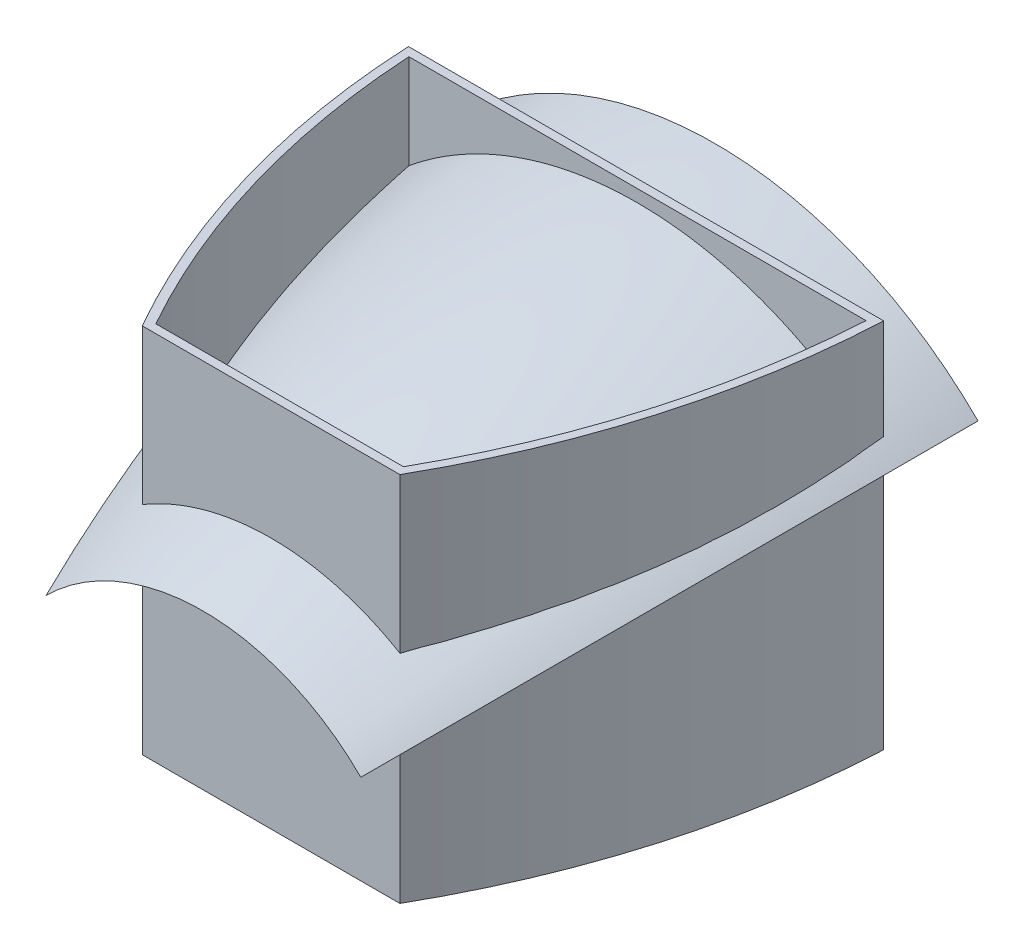
ISO-10303-21;
HEADER;
FILE_DESCRIPTION(('STEP AP214'),'2;1');
FILE_NAME('part.step','',(''),(''),'','','');
FILE_SCHEMA(('AUTOMOTIVE_DESIGN { 1 0 10303 214 1 1 1 1 }'));
ENDSEC;
DATA;
#1=APPLICATION_CONTEXT('core data for automotive mechanical design processes');
#2=APPLICATION_PROTOCOL_DEFINITION('international standard','automotive_design',2000,#1);
#3=PRODUCT_CONTEXT('',#1,'mechanical');
#4=PRODUCT('Part','Part','',(#3));
#5=PRODUCT_RELATED_PRODUCT_CATEGORY('part','',(#4));
#6=PRODUCT_DEFINITION_FORMATION('','',#4);
#7=PRODUCT_DEFINITION_CONTEXT('part definition',#1,'design');
#8=PRODUCT_DEFINITION('design','',#6,#7);
#9=PRODUCT_DEFINITION_SHAPE('','',#8);
#10=(LENGTH_UNIT() NAMED_UNIT(*) SI_UNIT(.MILLI.,.METRE.));
#11=(NAMED_UNIT(*) PLANE_ANGLE_UNIT() SI_UNIT($,.RADIAN.));
#12=(NAMED_UNIT(*) SI_UNIT($,.STERADIAN.) SOLID_ANGLE_UNIT());
#13=UNCERTAINTY_MEASURE_WITH_UNIT(LENGTH_MEASURE(1.E-05),#10,'distance_accuracy_value','');
#14=(GEOMETRIC_REPRESENTATION_CONTEXT(3) GLOBAL_UNCERTAINTY_ASSIGNED_CONTEXT((#13)) GLOBAL_UNIT_ASSIGNED_CONTEXT((#10,
#11,#12)) REPRESENTATION_CONTEXT('',''));
#15=CARTESIAN_POINT('',(0.,0.,0.));
#16=DIRECTION('',(0.,0.,1.));
#17=DIRECTION('',(1.,0.,0.));
#18=AXIS2_PLACEMENT_3D('',#15,#16,#17);
#19=CARTESIAN_POINT('',(-208.683165451727,129.750796681597,-13.5989334898139));
#20=DIRECTION('',(0.,1.,0.));
#21=DIRECTION('',(0.,0.,1.));
#22=AXIS2_PLACEMENT_3D('',#19,#20,#21);
#23=PLANE('',#22);
#24=DIRECTION('',(1.,0.,0.));
#25=VECTOR('',#24,1.);
#26=CARTESIAN_POINT('',(-45.,129.750796681597,131.));
#27=LINE('',#26,#25);
#28=CARTESIAN_POINT('',(-44.9999999999999,129.750796681597,131.));
#29=VERTEX_POINT('',#28);
#30=CARTESIAN_POINT('',(45.,129.750796681597,131.));
#31=VERTEX_POINT('',#30);
#32=EDGE_CURVE('E152',#29,#31,#27,.T.);
#33=ORIENTED_EDGE('',*,*,#32,.T.);
#34=CARTESIAN_POINT('',(-208.683165451727,129.750796681597,-13.5989334898139));
#35=DIRECTION('',(0.,1.,0.));
#36=DIRECTION('',(0.,0.,1.));
#37=AXIS2_PLACEMENT_3D('',#34,#35,#36);
#38=CIRCLE('',#37,292.);
#39=CARTESIAN_POINT('',(83.,129.750796681597,0.));
#40=VERTEX_POINT('',#39);
#41=EDGE_CURVE('E93',#31,#40,#38,.T.);
#42=ORIENTED_EDGE('',*,*,#41,.T.);
#43=DIRECTION('',(1.,0.,0.));
#44=VECTOR('',#43,1.);
#45=CARTESIAN_POINT('',(-83.,129.750796681597,0.));
#46=LINE('',#45,#44);
#47=CARTESIAN_POINT('',(-83.,129.750796681597,0.));
#48=VERTEX_POINT('',#47);
#49=EDGE_CURVE('E156',#48,#40,#46,.T.);
#50=ORIENTED_EDGE('',*,*,#49,.F.);
#51=CARTESIAN_POINT('',(208.683165451727,129.750796681597,-13.598933489814));
#52=DIRECTION('',(0.,-1.,0.));
#53=DIRECTION('',(0.,0.,-1.));
#54=AXIS2_PLACEMENT_3D('',#51,#52,#53);
#55=CIRCLE('',#54,292.);
#56=EDGE_CURVE('E159',#29,#48,#55,.T.);
#57=ORIENTED_EDGE('',*,*,#56,.F.);
#58=EDGE_LOOP('',(#33,#42,#50,#57));
#59=FACE_BOUND('',#58,.T.);
#60=DIRECTION('',(1.,0.,0.));
#61=VECTOR('',#60,1.);
#62=CARTESIAN_POINT('',(-45.,129.750796681597,128.));
#63=LINE('',#62,#61);
#64=CARTESIAN_POINT('',(-43.2508378795962,129.750796681597,128.));
#65=VERTEX_POINT('',#64);
#66=CARTESIAN_POINT('',(43.2508378795962,129.750796681597,128.));
#67=VERTEX_POINT('',#66);
#68=EDGE_CURVE('E142',#65,#67,#63,.T.);
#69=ORIENTED_EDGE('',*,*,#68,.F.);
#70=CARTESIAN_POINT('',(208.683165451727,129.750796681597,-13.598933489814));
#71=DIRECTION('',(0.,1.,0.));
#72=DIRECTION('',(0.,0.,1.));
#73=AXIS2_PLACEMENT_3D('',#70,#71,#72);
#74=CIRCLE('',#73,289.);
#75=CARTESIAN_POINT('',(-79.839754620493,129.750796681597,3.));
#76=VERTEX_POINT('',#75);
#77=EDGE_CURVE('E123',#65,#76,#74,.F.);
#78=ORIENTED_EDGE('',*,*,#77,.T.);
#79=DIRECTION('',(1.,0.,0.));
#80=VECTOR('',#79,1.);
#81=CARTESIAN_POINT('',(-83.,129.750796681597,3.));
#82=LINE('',#81,#80);
#83=CARTESIAN_POINT('',(79.839754620493,129.750796681597,3.));
#84=VERTEX_POINT('',#83);
#85=EDGE_CURVE('E58',#76,#84,#82,.T.);
#86=ORIENTED_EDGE('',*,*,#85,.T.);
#87=CARTESIAN_POINT('',(-208.683165451727,129.750796681597,-13.5989334898139));
#88=DIRECTION('',(0.,1.,0.));
#89=DIRECTION('',(0.,0.,1.));
#90=AXIS2_PLACEMENT_3D('',#87,#88,#89);
#91=CIRCLE('',#90,289.);
#92=EDGE_CURVE('E144',#67,#84,#91,.T.);
#93=ORIENTED_EDGE('',*,*,#92,.F.);
#94=EDGE_LOOP('',(#69,#78,#86,#93));
#95=FACE_BOUND('',#94,.T.);
#96=ADVANCED_FACE('F43',(#59,#95),#23,.T.);
#97=CARTESIAN_POINT('',(-45.,129.750796681597,131.));
#98=DIRECTION('',(0.,0.,-1.));
#99=DIRECTION('',(-1.,0.,0.));
#100=AXIS2_PLACEMENT_3D('',#97,#98,#99);
#101=PLANE('',#100);
#102=DIRECTION('',(1.,0.,0.));
#103=VECTOR('',#102,1.);
#104=CARTESIAN_POINT('',(-45.,0.,131.));
#105=LINE('',#104,#103);
#106=CARTESIAN_POINT('',(-44.9999999999999,0.,131.));
#107=VERTEX_POINT('',#106);
#108=CARTESIAN_POINT('',(45.,0.,131.));
#109=VERTEX_POINT('',#108);
#110=EDGE_CURVE('E161',#107,#109,#105,.T.);
#111=ORIENTED_EDGE('',*,*,#110,.T.);
#112=DIRECTION('',(0.,-1.,0.));
#113=VECTOR('',#112,1.);
#114=CARTESIAN_POINT('',(45.,129.750796681597,131.));
#115=LINE('',#114,#113);
#116=EDGE_CURVE('E12',#31,#109,#115,.T.);
#117=ORIENTED_EDGE('',*,*,#116,.F.);
#118=ORIENTED_EDGE('',*,*,#32,.F.);
#119=DIRECTION('',(0.,-1.,0.));
#120=VECTOR('',#119,1.);
#121=CARTESIAN_POINT('',(-44.9999999999999,129.750796681597,131.));
#122=LINE('',#121,#120);
#123=EDGE_CURVE('E67',#29,#107,#122,.T.);
#124=ORIENTED_EDGE('',*,*,#123,.T.);
#125=EDGE_LOOP('',(#111,#117,#118,#124));
#126=FACE_BOUND('',#125,.T.);
#127=ADVANCED_FACE('F45',(#126),#101,.F.);
#128=CARTESIAN_POINT('',(-208.683165451727,129.750796681597,-13.5989334898139));
#129=DIRECTION('',(0.,-1.,0.));
#130=DIRECTION('',(0.,0.,-1.));
#131=AXIS2_PLACEMENT_3D('',#128,#129,#130);
#132=CYLINDRICAL_SURFACE('',#131,292.);
#133=CARTESIAN_POINT('',(-208.683165451727,0.,-13.5989334898139));
#134=DIRECTION('',(0.,1.,0.));
#135=DIRECTION('',(0.,0.,1.));
#136=AXIS2_PLACEMENT_3D('',#133,#134,#135);
#137=CIRCLE('',#136,292.);
#138=CARTESIAN_POINT('',(83.,0.,0.));
#139=VERTEX_POINT('',#138);
#140=EDGE_CURVE('E163',#109,#139,#137,.T.);
#141=ORIENTED_EDGE('',*,*,#140,.T.);
#142=DIRECTION('',(0.,-1.,0.));
#143=VECTOR('',#142,1.);
#144=CARTESIAN_POINT('',(83.,129.750796681597,0.));
#145=LINE('',#144,#143);
#146=EDGE_CURVE('E51',#40,#139,#145,.T.);
#147=ORIENTED_EDGE('',*,*,#146,.F.);
#148=ORIENTED_EDGE('',*,*,#41,.F.);
#149=ORIENTED_EDGE('',*,*,#116,.T.);
#150=EDGE_LOOP('',(#141,#147,#148,#149));
#151=FACE_BOUND('',#150,.T.);
#152=ADVANCED_FACE('F177',(#151),#132,.T.);
#153=CARTESIAN_POINT('',(-83.,129.750796681597,0.));
#154=DIRECTION('',(0.,0.,-1.));
#155=DIRECTION('',(-1.,0.,0.));
#156=AXIS2_PLACEMENT_3D('',#153,#154,#155);
#157=PLANE('',#156);
#158=DIRECTION('',(1.,0.,0.));
#159=VECTOR('',#158,1.);
#160=CARTESIAN_POINT('',(-83.,0.,0.));
#161=LINE('',#160,#159);
#162=CARTESIAN_POINT('',(-83.,0.,0.));
#163=VERTEX_POINT('',#162);
#164=EDGE_CURVE('E166',#163,#139,#161,.T.);
#165=ORIENTED_EDGE('',*,*,#164,.F.);
#166=DIRECTION('',(0.,-1.,0.));
#167=VECTOR('',#166,1.);
#168=CARTESIAN_POINT('',(-83.,129.750796681597,0.));
#169=LINE('',#168,#167);
#170=EDGE_CURVE('E172',#48,#163,#169,.T.);
#171=ORIENTED_EDGE('',*,*,#170,.F.);
#172=ORIENTED_EDGE('',*,*,#49,.T.);
#173=ORIENTED_EDGE('',*,*,#146,.T.);
#174=EDGE_LOOP('',(#165,#171,#172,#173));
#175=FACE_BOUND('',#174,.T.);
#176=ADVANCED_FACE('F175',(#175),#157,.T.);
#177=CARTESIAN_POINT('',(208.683165451727,129.750796681597,-13.598933489814));
#178=DIRECTION('',(0.,-1.,0.));
#179=DIRECTION('',(0.,0.,-1.));
#180=AXIS2_PLACEMENT_3D('',#177,#178,#179);
#181=CYLINDRICAL_SURFACE('',#180,292.);
#182=CARTESIAN_POINT('',(208.683165451727,0.,-13.598933489814));
#183=DIRECTION('',(0.,-1.,0.));
#184=DIRECTION('',(0.,0.,-1.));
#185=AXIS2_PLACEMENT_3D('',#182,#183,#184);
#186=CIRCLE('',#185,292.);
#187=EDGE_CURVE('E154',#107,#163,#186,.T.);
#188=ORIENTED_EDGE('',*,*,#187,.F.);
#189=ORIENTED_EDGE('',*,*,#123,.F.);
#190=ORIENTED_EDGE('',*,*,#56,.T.);
#191=ORIENTED_EDGE('',*,*,#170,.T.);
#192=EDGE_LOOP('',(#188,#189,#190,#191));
#193=FACE_BOUND('',#192,.T.);
#194=ADVANCED_FACE('F181',(#193),#181,.T.);
#195=CARTESIAN_POINT('',(-208.683165451727,0.,-13.5989334898139));
#196=DIRECTION('',(0.,1.,0.));
#197=DIRECTION('',(0.,0.,1.));
#198=AXIS2_PLACEMENT_3D('',#195,#196,#197);
#199=PLANE('',#198);
#200=ORIENTED_EDGE('',*,*,#110,.F.);
#201=ORIENTED_EDGE('',*,*,#187,.T.);
#202=ORIENTED_EDGE('',*,*,#164,.T.);
#203=ORIENTED_EDGE('',*,*,#140,.F.);
#204=EDGE_LOOP('',(#200,#201,#202,#203));
#205=FACE_BOUND('',#204,.T.);
#206=ADVANCED_FACE('F180',(#205),#199,.F.);
#207=CARTESIAN_POINT('',(-45.,129.750796681597,128.));
#208=DIRECTION('',(0.,0.,-1.));
#209=DIRECTION('',(-1.,0.,0.));
#210=AXIS2_PLACEMENT_3D('',#207,#208,#209);
#211=PLANE('',#210);
#212=DIRECTION('',(1.,0.,0.));
#213=VECTOR('',#212,1.);
#214=CARTESIAN_POINT('',(-45.,3.,128.));
#215=LINE('',#214,#213);
#216=CARTESIAN_POINT('',(-43.2508378795962,3.,128.));
#217=VERTEX_POINT('',#216);
#218=CARTESIAN_POINT('',(43.2508378795962,3.,128.));
#219=VERTEX_POINT('',#218);
#220=EDGE_CURVE('E130',#217,#219,#215,.T.);
#221=ORIENTED_EDGE('',*,*,#220,.F.);
#222=DIRECTION('',(0.,-1.,0.));
#223=VECTOR('',#222,1.);
#224=CARTESIAN_POINT('',(-43.2508378795962,129.750796681597,128.));
#225=LINE('',#224,#223);
#226=EDGE_CURVE('E117',#65,#217,#225,.T.);
#227=ORIENTED_EDGE('',*,*,#226,.F.);
#228=ORIENTED_EDGE('',*,*,#68,.T.);
#229=DIRECTION('',(0.,-1.,0.));
#230=VECTOR('',#229,1.);
#231=CARTESIAN_POINT('',(43.2508378795962,129.750796681597,128.));
#232=LINE('',#231,#230);
#233=EDGE_CURVE('E133',#67,#219,#232,.T.);
#234=ORIENTED_EDGE('',*,*,#233,.T.);
#235=EDGE_LOOP('',(#221,#227,#228,#234));
#236=FACE_BOUND('',#235,.T.);
#237=ADVANCED_FACE('F131',(#236),#211,.T.);
#238=CARTESIAN_POINT('',(-208.683165451727,129.750796681597,-13.5989334898139));
#239=DIRECTION('',(0.,-1.,0.));
#240=DIRECTION('',(0.,0.,-1.));
#241=AXIS2_PLACEMENT_3D('',#238,#239,#240);
#242=CYLINDRICAL_SURFACE('',#241,289.);
#243=CARTESIAN_POINT('',(-208.683165451727,3.,-13.5989334898139));
#244=DIRECTION('',(0.,1.,0.));
#245=DIRECTION('',(0.,0.,1.));
#246=AXIS2_PLACEMENT_3D('',#243,#244,#245);
#247=CIRCLE('',#246,289.);
#248=CARTESIAN_POINT('',(79.839754620493,3.,3.));
#249=VERTEX_POINT('',#248);
#250=EDGE_CURVE('E136',#219,#249,#247,.T.);
#251=ORIENTED_EDGE('',*,*,#250,.F.);
#252=ORIENTED_EDGE('',*,*,#233,.F.);
#253=ORIENTED_EDGE('',*,*,#92,.T.);
#254=DIRECTION('',(0.,-1.,0.));
#255=VECTOR('',#254,1.);
#256=CARTESIAN_POINT('',(79.839754620493,129.750796681597,3.));
#257=LINE('',#256,#255);
#258=EDGE_CURVE('E274',#84,#249,#257,.T.);
#259=ORIENTED_EDGE('',*,*,#258,.T.);
#260=EDGE_LOOP('',(#251,#252,#253,#259));
#261=FACE_BOUND('',#260,.T.);
#262=ADVANCED_FACE('F219',(#261),#242,.F.);
#263=CARTESIAN_POINT('',(-83.,129.750796681597,3.));
#264=DIRECTION('',(0.,0.,-1.));
#265=DIRECTION('',(-1.,0.,0.));
#266=AXIS2_PLACEMENT_3D('',#263,#264,#265);
#267=PLANE('',#266);
#268=DIRECTION('',(1.,0.,0.));
#269=VECTOR('',#268,1.);
#270=CARTESIAN_POINT('',(-83.,3.,3.));
#271=LINE('',#270,#269);
#272=CARTESIAN_POINT('',(-79.839754620493,3.,3.));
#273=VERTEX_POINT('',#272);
#274=EDGE_CURVE('E141',#273,#249,#271,.T.);
#275=ORIENTED_EDGE('',*,*,#274,.T.);
#276=ORIENTED_EDGE('',*,*,#258,.F.);
#277=ORIENTED_EDGE('',*,*,#85,.F.);
#278=DIRECTION('',(0.,-1.,0.));
#279=VECTOR('',#278,1.);
#280=CARTESIAN_POINT('',(-79.839754620493,129.750796681597,3.));
#281=LINE('',#280,#279);
#282=EDGE_CURVE('E126',#76,#273,#281,.T.);
#283=ORIENTED_EDGE('',*,*,#282,.T.);
#284=EDGE_LOOP('',(#275,#276,#277,#283));
#285=FACE_BOUND('',#284,.T.);
#286=ADVANCED_FACE('F226',(#285),#267,.F.);
#287=CARTESIAN_POINT('',(208.683165451727,129.750796681597,-13.598933489814));
#288=DIRECTION('',(0.,-1.,0.));
#289=DIRECTION('',(0.,0.,-1.));
#290=AXIS2_PLACEMENT_3D('',#287,#288,#289);
#291=CYLINDRICAL_SURFACE('',#290,289.);
#292=CARTESIAN_POINT('',(208.683165451727,3.,-13.598933489814));
#293=DIRECTION('',(0.,1.,0.));
#294=DIRECTION('',(0.,0.,1.));
#295=AXIS2_PLACEMENT_3D('',#292,#293,#294);
#296=CIRCLE('',#295,289.);
#297=EDGE_CURVE('E121',#217,#273,#296,.F.);
#298=ORIENTED_EDGE('',*,*,#297,.T.);
#299=ORIENTED_EDGE('',*,*,#282,.F.);
#300=ORIENTED_EDGE('',*,*,#77,.F.);
#301=ORIENTED_EDGE('',*,*,#226,.T.);
#302=EDGE_LOOP('',(#298,#299,#300,#301));
#303=FACE_BOUND('',#302,.T.);
#304=ADVANCED_FACE('F119',(#303),#291,.F.);
#305=CARTESIAN_POINT('',(-208.683165451727,3.,-13.5989334898139));
#306=DIRECTION('',(0.,1.,0.));
#307=DIRECTION('',(0.,0.,1.));
#308=AXIS2_PLACEMENT_3D('',#305,#306,#307);
#309=PLANE('',#308);
#310=ORIENTED_EDGE('',*,*,#220,.T.);
#311=ORIENTED_EDGE('',*,*,#250,.T.);
#312=ORIENTED_EDGE('',*,*,#274,.F.);
#313=ORIENTED_EDGE('',*,*,#297,.F.);
#314=EDGE_LOOP('',(#310,#311,#312,#313));
#315=FACE_BOUND('',#314,.T.);
#316=ADVANCED_FACE('F139',(#315),#309,.T.);
#317=CLOSED_SHELL('',(#96,#127,#152,#176,#194,#206,#237,#262,#286,#304,#316));
#318=MANIFOLD_SOLID_BREP('B2',#317);
#319=CARTESIAN_POINT('',(0.,0.,-107.580301930694));
#320=DIRECTION('',(0.,0.,-1.));
#321=DIRECTION('',(-1.,0.,0.));
#322=AXIS2_PLACEMENT_3D('',#319,#320,#321);
#323=DEGENERATE_TOROIDAL_SURFACE('',#322,490.671567182131,626.,.F.);
#324=CARTESIAN_POINT('',(0.,0.,154.642813074418));
#325=DIRECTION('',(0.,0.,-1.));
#326=DIRECTION('',(-1.,0.,0.));
#327=AXIS2_PLACEMENT_3D('',#324,#325,#326);
#328=CIRCLE('',#327,77.7605201924436);
#329=CARTESIAN_POINT('',(-54.9849911366704,54.9849911366702,154.642813074418));
#330=VERTEX_POINT('',#329);
#331=CARTESIAN_POINT('',(54.9849911366704,54.9849911366702,154.642813074418));
#332=VERTEX_POINT('',#331);
#333=EDGE_CURVE('E41',#330,#332,#328,.T.);
#334=ORIENTED_EDGE('',*,*,#333,.T.);
#335=CARTESIAN_POINT('',(-346.957192489916,-346.957192489915,-107.580301930694));
#336=DIRECTION('',(-0.707106781186546,0.707106781186549,0.));
#337=DIRECTION('',(0.,0.,1.));
#338=AXIS2_PLACEMENT_3D('',#335,#336,#337);
#339=CIRCLE('',#338,626.);
#340=CARTESIAN_POINT('',(91.7476681979144,91.7476681979141,-24.2011053781704));
#341=VERTEX_POINT('',#340);
#342=EDGE_CURVE('E339',#341,#332,#339,.F.);
#343=ORIENTED_EDGE('',*,*,#342,.F.);
#344=CARTESIAN_POINT('',(0.,0.,-24.2011053781704));
#345=DIRECTION('',(0.,0.,-1.));
#346=DIRECTION('',(-1.,0.,0.));
#347=AXIS2_PLACEMENT_3D('',#344,#345,#346);
#348=CIRCLE('',#347,129.750796681597);
#349=CARTESIAN_POINT('',(-91.7476681979144,91.7476681979141,-24.2011053781704));
#350=VERTEX_POINT('',#349);
#351=EDGE_CURVE('E290',#350,#341,#348,.T.);
#352=ORIENTED_EDGE('',*,*,#351,.F.);
#353=CARTESIAN_POINT('',(346.957192489916,-346.957192489915,-107.580301930694));
#354=DIRECTION('',(-0.707106781186546,-0.707106781186549,0.));
#355=DIRECTION('',(0.,0.,1.));
#356=AXIS2_PLACEMENT_3D('',#353,#354,#355);
#357=CIRCLE('',#356,626.);
#358=EDGE_CURVE('E345',#350,#330,#357,.F.);
#359=ORIENTED_EDGE('',*,*,#358,.T.);
#360=EDGE_LOOP('',(#334,#343,#352,#359));
#361=FACE_BOUND('',#360,.T.);
#362=ADVANCED_FACE('F282',(#361),#323,.F.);
#363=CARTESIAN_POINT('',(0.,0.,154.642813074418));
#364=DIRECTION('',(0.,0.,-1.));
#365=DIRECTION('',(-1.,0.,0.));
#366=AXIS2_PLACEMENT_3D('',#363,#364,#365);
#367=CONICAL_SURFACE('',#366,77.7605201924436,0.282904799297569);
#368=DIRECTION('',(-0.197386136933732,0.197386136933731,-0.960248627123599));
#369=VECTOR('',#368,1.);
#370=CARTESIAN_POINT('',(-73.3663296672924,73.3663296672921,65.2208538481242));
#371=LINE('',#370,#369);
#372=EDGE_CURVE('E348',#330,#350,#371,.T.);
#373=ORIENTED_EDGE('',*,*,#372,.T.);
#374=ORIENTED_EDGE('',*,*,#351,.T.);
#375=DIRECTION('',(0.197386136933731,0.197386136933731,-0.960248627123599));
#376=VECTOR('',#375,1.);
#377=CARTESIAN_POINT('',(73.3663296672924,73.3663296672921,65.2208538481242));
#378=LINE('',#377,#376);
#379=EDGE_CURVE('E342',#332,#341,#378,.T.);
#380=ORIENTED_EDGE('',*,*,#379,.F.);
#381=ORIENTED_EDGE('',*,*,#333,.F.);
#382=EDGE_LOOP('',(#373,#374,#380,#381));
#383=FACE_BOUND('',#382,.T.);
#384=ADVANCED_FACE('F284',(#383),#367,.F.);
#385=CARTESIAN_POINT('',(346.957192489916,-346.957192489915,-107.580301930694));
#386=DIRECTION('',(-0.707106781186546,-0.707106781186549,0.));
#387=DIRECTION('',(0.707106781186549,-0.707106781186546,0.));
#388=AXIS2_PLACEMENT_3D('',#385,#386,#387);
#389=PLANE('',#388);
#390=CARTESIAN_POINT('',(346.957192489916,-346.957192489915,-107.580301930694));
#391=DIRECTION('',(0.707106781186546,0.707106781186549,0.));
#392=DIRECTION('',(0.,0.,1.));
#393=AXIS2_PLACEMENT_3D('',#390,#391,#392);
#394=CIRCLE('',#393,625.);
#395=CARTESIAN_POINT('',(-89.5649058482531,89.5649058482528,-10.));
#396=VERTEX_POINT('',#395);
#397=CARTESIAN_POINT('',(-58.52575011806,58.5257501180598,141.));
#398=VERTEX_POINT('',#397);
#399=EDGE_CURVE('E297',#396,#398,#394,.T.);
#400=ORIENTED_EDGE('',*,*,#399,.T.);
#401=DIRECTION('',(-0.197386136933731,0.197386136933731,-0.960248627123599));
#402=VECTOR('',#401,1.);
#403=CARTESIAN_POINT('',(-58.52575011806,58.5257501180598,141.));
#404=LINE('',#403,#402);
#405=EDGE_CURVE('E325',#398,#396,#404,.T.);
#406=ORIENTED_EDGE('',*,*,#405,.T.);
#407=EDGE_LOOP('',(#400,#406));
#408=FACE_BOUND('',#407,.T.);
#409=ORIENTED_EDGE('',*,*,#358,.F.);
#410=ORIENTED_EDGE('',*,*,#372,.F.);
#411=EDGE_LOOP('',(#409,#410));
#412=FACE_BOUND('',#411,.T.);
#413=ADVANCED_FACE('F357',(#408,#412),#389,.T.);
#414=CARTESIAN_POINT('',(-346.957192489916,-346.957192489915,-107.580301930694));
#415=DIRECTION('',(-0.707106781186546,0.707106781186549,0.));
#416=DIRECTION('',(-0.707106781186549,-0.707106781186546,0.));
#417=AXIS2_PLACEMENT_3D('',#414,#415,#416);
#418=PLANE('',#417);
#419=DIRECTION('',(0.197386136933731,0.197386136933731,-0.960248627123599));
#420=VECTOR('',#419,1.);
#421=CARTESIAN_POINT('',(58.52575011806,58.5257501180598,141.));
#422=LINE('',#421,#420);
#423=CARTESIAN_POINT('',(58.52575011806,58.5257501180598,141.));
#424=VERTEX_POINT('',#423);
#425=CARTESIAN_POINT('',(89.5649058482531,89.5649058482528,-10.));
#426=VERTEX_POINT('',#425);
#427=EDGE_CURVE('E328',#424,#426,#422,.T.);
#428=ORIENTED_EDGE('',*,*,#427,.F.);
#429=CARTESIAN_POINT('',(-346.957192489916,-346.957192489915,-107.580301930694));
#430=DIRECTION('',(0.707106781186546,-0.707106781186549,0.));
#431=DIRECTION('',(0.,0.,1.));
#432=AXIS2_PLACEMENT_3D('',#429,#430,#431);
#433=CIRCLE('',#432,625.);
#434=EDGE_CURVE('E302',#426,#424,#433,.T.);
#435=ORIENTED_EDGE('',*,*,#434,.F.);
#436=EDGE_LOOP('',(#428,#435));
#437=FACE_BOUND('',#436,.T.);
#438=ORIENTED_EDGE('',*,*,#342,.T.);
#439=ORIENTED_EDGE('',*,*,#379,.T.);
#440=EDGE_LOOP('',(#438,#439));
#441=FACE_BOUND('',#440,.T.);
#442=ADVANCED_FACE('F332',(#437,#441),#418,.F.);
#443=CARTESIAN_POINT('',(0.,0.,-107.580301930694));
#444=DIRECTION('',(0.,0.,-1.));
#445=DIRECTION('',(-1.,0.,0.));
#446=AXIS2_PLACEMENT_3D('',#443,#444,#445);
#447=DEGENERATE_TOROIDAL_SURFACE('',#446,490.671567182131,625.,.F.);
#448=CARTESIAN_POINT('',(0.,0.,141.));
#449=DIRECTION('',(0.,0.,-1.));
#450=DIRECTION('',(-1.,0.,0.));
#451=AXIS2_PLACEMENT_3D('',#448,#449,#450);
#452=CIRCLE('',#451,82.7679095650191);
#453=EDGE_CURVE('E324',#398,#424,#452,.T.);
#454=ORIENTED_EDGE('',*,*,#453,.F.);
#455=ORIENTED_EDGE('',*,*,#399,.F.);
#456=CARTESIAN_POINT('',(0.,0.,-10.));
#457=DIRECTION('',(0.,0.,-1.));
#458=DIRECTION('',(-1.,0.,0.));
#459=AXIS2_PLACEMENT_3D('',#456,#457,#458);
#460=CIRCLE('',#459,126.663904563269);
#461=EDGE_CURVE('E318',#396,#426,#460,.T.);
#462=ORIENTED_EDGE('',*,*,#461,.T.);
#463=ORIENTED_EDGE('',*,*,#434,.T.);
#464=EDGE_LOOP('',(#454,#455,#462,#463));
#465=FACE_BOUND('',#464,.T.);
#466=ADVANCED_FACE('F320',(#465),#447,.T.);
#467=CARTESIAN_POINT('',(0.,0.,141.));
#468=DIRECTION('',(0.,0.,-1.));
#469=DIRECTION('',(-1.,0.,0.));
#470=AXIS2_PLACEMENT_3D('',#467,#468,#469);
#471=CONICAL_SURFACE('',#470,82.7679095650191,0.282904799297569);
#472=ORIENTED_EDGE('',*,*,#405,.F.);
#473=ORIENTED_EDGE('',*,*,#453,.T.);
#474=ORIENTED_EDGE('',*,*,#427,.T.);
#475=ORIENTED_EDGE('',*,*,#461,.F.);
#476=EDGE_LOOP('',(#472,#473,#474,#475));
#477=FACE_BOUND('',#476,.T.);
#478=ADVANCED_FACE('F329',(#477),#471,.T.);
#479=CLOSED_SHELL('',(#362,#384,#413,#442,#466,#478));
#480=MANIFOLD_SOLID_BREP('B6',#479);
#481=ADVANCED_BREP_SHAPE_REPRESENTATION('',(#18,#318,#480),#14);
#482=SHAPE_DEFINITION_REPRESENTATION(#9,#481);
ENDSEC;
END-ISO-10303-21;
